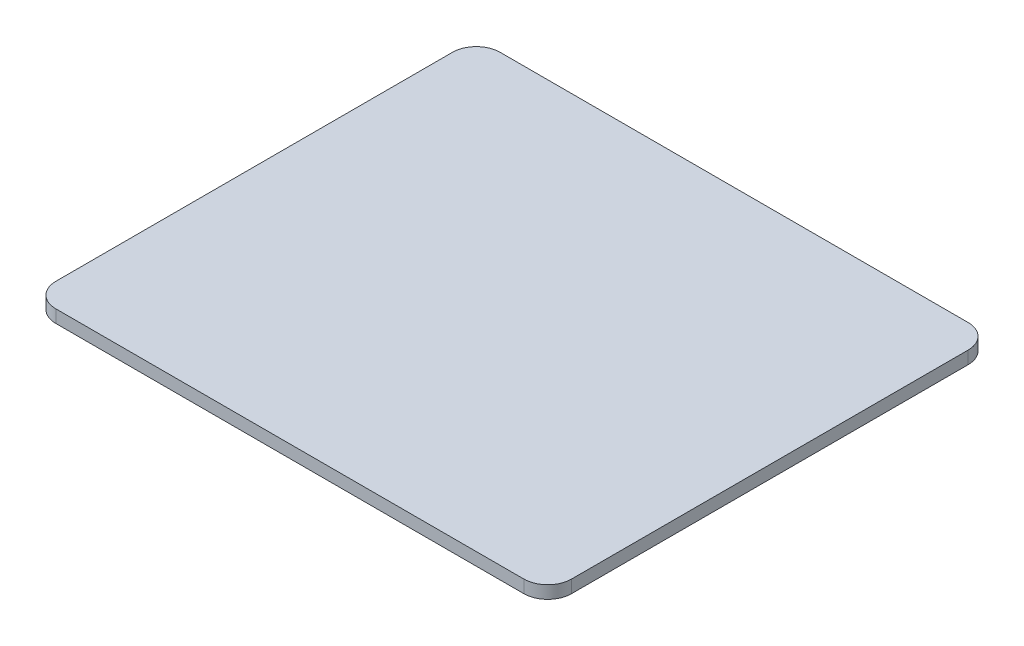
ISO-10303-21;
HEADER;
FILE_DESCRIPTION(('STEP AP214'),'2;1');
FILE_NAME('part.step','',(''),(''),'','','');
FILE_SCHEMA(('AUTOMOTIVE_DESIGN { 1 0 10303 214 1 1 1 1 }'));
ENDSEC;
DATA;
#1=APPLICATION_CONTEXT('core data for automotive mechanical design processes');
#2=APPLICATION_PROTOCOL_DEFINITION('international standard','automotive_design',2000,#1);
#3=PRODUCT_CONTEXT('',#1,'mechanical');
#4=PRODUCT('Part','Part','',(#3));
#5=PRODUCT_RELATED_PRODUCT_CATEGORY('part','',(#4));
#6=PRODUCT_DEFINITION_FORMATION('','',#4);
#7=PRODUCT_DEFINITION_CONTEXT('part definition',#1,'design');
#8=PRODUCT_DEFINITION('design','',#6,#7);
#9=PRODUCT_DEFINITION_SHAPE('','',#8);
#10=(LENGTH_UNIT() NAMED_UNIT(*) SI_UNIT(.MILLI.,.METRE.));
#11=(NAMED_UNIT(*) PLANE_ANGLE_UNIT() SI_UNIT($,.RADIAN.));
#12=(NAMED_UNIT(*) SI_UNIT($,.STERADIAN.) SOLID_ANGLE_UNIT());
#13=UNCERTAINTY_MEASURE_WITH_UNIT(LENGTH_MEASURE(1.E-05),#10,'distance_accuracy_value','');
#14=(GEOMETRIC_REPRESENTATION_CONTEXT(3) GLOBAL_UNCERTAINTY_ASSIGNED_CONTEXT((#13)) GLOBAL_UNIT_ASSIGNED_CONTEXT((#10,
#11,#12)) REPRESENTATION_CONTEXT('',''));
#15=CARTESIAN_POINT('',(0.,0.,0.));
#16=DIRECTION('',(0.,0.,1.));
#17=DIRECTION('',(1.,0.,0.));
#18=AXIS2_PLACEMENT_3D('',#15,#16,#17);
#19=CARTESIAN_POINT('',(-32.5,1.6,28.));
#20=DIRECTION('',(1.,0.,0.));
#21=DIRECTION('',(0.,0.,-1.));
#22=AXIS2_PLACEMENT_3D('',#19,#20,#21);
#23=PLANE('',#22);
#24=DIRECTION('',(0.,0.,1.));
#25=VECTOR('',#24,1.);
#26=CARTESIAN_POINT('',(-32.5,1.6,28.));
#27=LINE('',#26,#25);
#28=CARTESIAN_POINT('',(-32.5,1.6,-25.));
#29=VERTEX_POINT('',#28);
#30=CARTESIAN_POINT('',(-32.5,1.6,25.));
#31=VERTEX_POINT('',#30);
#32=EDGE_CURVE('E122',#29,#31,#27,.T.);
#33=ORIENTED_EDGE('',*,*,#32,.F.);
#34=DIRECTION('',(0.,-1.,0.));
#35=VECTOR('',#34,1.);
#36=CARTESIAN_POINT('',(-32.5,1.6,-25.));
#37=LINE('',#36,#35);
#38=CARTESIAN_POINT('',(-32.5,0.,-25.));
#39=VERTEX_POINT('',#38);
#40=EDGE_CURVE('E107',#29,#39,#37,.T.);
#41=ORIENTED_EDGE('',*,*,#40,.T.);
#42=DIRECTION('',(0.,0.,1.));
#43=VECTOR('',#42,1.);
#44=CARTESIAN_POINT('',(-32.5,0.,28.));
#45=LINE('',#44,#43);
#46=CARTESIAN_POINT('',(-32.5,0.,25.));
#47=VERTEX_POINT('',#46);
#48=EDGE_CURVE('E119',#39,#47,#45,.T.);
#49=ORIENTED_EDGE('',*,*,#48,.T.);
#50=DIRECTION('',(0.,-1.,0.));
#51=VECTOR('',#50,1.);
#52=CARTESIAN_POINT('',(-32.5,1.6,25.));
#53=LINE('',#52,#51);
#54=EDGE_CURVE('E124',#47,#31,#53,.F.);
#55=ORIENTED_EDGE('',*,*,#54,.T.);
#56=EDGE_LOOP('',(#33,#41,#49,#55));
#57=FACE_BOUND('',#56,.T.);
#58=ADVANCED_FACE('F37',(#57),#23,.F.);
#59=CARTESIAN_POINT('',(32.5,1.6,28.));
#60=DIRECTION('',(0.,0.,-1.));
#61=DIRECTION('',(-1.,0.,0.));
#62=AXIS2_PLACEMENT_3D('',#59,#60,#61);
#63=PLANE('',#62);
#64=DIRECTION('',(1.,0.,0.));
#65=VECTOR('',#64,1.);
#66=CARTESIAN_POINT('',(32.5,0.,28.));
#67=LINE('',#66,#65);
#68=CARTESIAN_POINT('',(-29.5,0.,28.));
#69=VERTEX_POINT('',#68);
#70=CARTESIAN_POINT('',(29.5,0.,28.));
#71=VERTEX_POINT('',#70);
#72=EDGE_CURVE('E128',#69,#71,#67,.T.);
#73=ORIENTED_EDGE('',*,*,#72,.T.);
#74=DIRECTION('',(0.,-1.,0.));
#75=VECTOR('',#74,1.);
#76=CARTESIAN_POINT('',(29.5,1.6,28.));
#77=LINE('',#76,#75);
#78=CARTESIAN_POINT('',(29.5,1.6,28.));
#79=VERTEX_POINT('',#78);
#80=EDGE_CURVE('E11',#71,#79,#77,.F.);
#81=ORIENTED_EDGE('',*,*,#80,.T.);
#82=DIRECTION('',(1.,0.,0.));
#83=VECTOR('',#82,1.);
#84=CARTESIAN_POINT('',(32.5,1.6,28.));
#85=LINE('',#84,#83);
#86=CARTESIAN_POINT('',(-29.5,1.6,28.));
#87=VERTEX_POINT('',#86);
#88=EDGE_CURVE('E164',#87,#79,#85,.T.);
#89=ORIENTED_EDGE('',*,*,#88,.F.);
#90=DIRECTION('',(0.,-1.,0.));
#91=VECTOR('',#90,1.);
#92=CARTESIAN_POINT('',(-29.5,1.6,28.));
#93=LINE('',#92,#91);
#94=EDGE_CURVE('E45',#87,#69,#93,.T.);
#95=ORIENTED_EDGE('',*,*,#94,.T.);
#96=EDGE_LOOP('',(#73,#81,#89,#95));
#97=FACE_BOUND('',#96,.T.);
#98=ADVANCED_FACE('F162',(#97),#63,.F.);
#99=CARTESIAN_POINT('',(32.5,1.6,28.));
#100=DIRECTION('',(-1.,0.,0.));
#101=DIRECTION('',(0.,0.,1.));
#102=AXIS2_PLACEMENT_3D('',#99,#100,#101);
#103=PLANE('',#102);
#104=DIRECTION('',(0.,0.,-1.));
#105=VECTOR('',#104,1.);
#106=CARTESIAN_POINT('',(32.5,0.,28.));
#107=LINE('',#106,#105);
#108=CARTESIAN_POINT('',(32.5,0.,25.));
#109=VERTEX_POINT('',#108);
#110=CARTESIAN_POINT('',(32.5,0.,-25.));
#111=VERTEX_POINT('',#110);
#112=EDGE_CURVE('E131',#109,#111,#107,.T.);
#113=ORIENTED_EDGE('',*,*,#112,.T.);
#114=DIRECTION('',(0.,-1.,0.));
#115=VECTOR('',#114,1.);
#116=CARTESIAN_POINT('',(32.5,1.6,-25.));
#117=LINE('',#116,#115);
#118=CARTESIAN_POINT('',(32.5,1.6,-25.));
#119=VERTEX_POINT('',#118);
#120=EDGE_CURVE('E52',#111,#119,#117,.F.);
#121=ORIENTED_EDGE('',*,*,#120,.T.);
#122=DIRECTION('',(0.,0.,-1.));
#123=VECTOR('',#122,1.);
#124=CARTESIAN_POINT('',(32.5,1.6,28.));
#125=LINE('',#124,#123);
#126=CARTESIAN_POINT('',(32.5,1.6,25.));
#127=VERTEX_POINT('',#126);
#128=EDGE_CURVE('E172',#127,#119,#125,.T.);
#129=ORIENTED_EDGE('',*,*,#128,.F.);
#130=DIRECTION('',(0.,-1.,0.));
#131=VECTOR('',#130,1.);
#132=CARTESIAN_POINT('',(32.5,1.6,25.));
#133=LINE('',#132,#131);
#134=EDGE_CURVE('E155',#127,#109,#133,.T.);
#135=ORIENTED_EDGE('',*,*,#134,.T.);
#136=EDGE_LOOP('',(#113,#121,#129,#135));
#137=FACE_BOUND('',#136,.T.);
#138=ADVANCED_FACE('F171',(#137),#103,.F.);
#139=CARTESIAN_POINT('',(32.5,1.6,-28.));
#140=DIRECTION('',(0.,0.,1.));
#141=DIRECTION('',(1.,0.,0.));
#142=AXIS2_PLACEMENT_3D('',#139,#140,#141);
#143=PLANE('',#142);
#144=DIRECTION('',(-1.,0.,0.));
#145=VECTOR('',#144,1.);
#146=CARTESIAN_POINT('',(32.5,0.,-28.));
#147=LINE('',#146,#145);
#148=CARTESIAN_POINT('',(29.5,0.,-28.));
#149=VERTEX_POINT('',#148);
#150=CARTESIAN_POINT('',(-29.5,0.,-28.));
#151=VERTEX_POINT('',#150);
#152=EDGE_CURVE('E138',#149,#151,#147,.T.);
#153=ORIENTED_EDGE('',*,*,#152,.T.);
#154=DIRECTION('',(0.,-1.,0.));
#155=VECTOR('',#154,1.);
#156=CARTESIAN_POINT('',(-29.5,1.6,-28.));
#157=LINE('',#156,#155);
#158=CARTESIAN_POINT('',(-29.5,1.6,-28.));
#159=VERTEX_POINT('',#158);
#160=EDGE_CURVE('E108',#151,#159,#157,.F.);
#161=ORIENTED_EDGE('',*,*,#160,.T.);
#162=DIRECTION('',(-1.,0.,0.));
#163=VECTOR('',#162,1.);
#164=CARTESIAN_POINT('',(32.5,1.6,-28.));
#165=LINE('',#164,#163);
#166=CARTESIAN_POINT('',(29.5,1.6,-28.));
#167=VERTEX_POINT('',#166);
#168=EDGE_CURVE('E134',#167,#159,#165,.T.);
#169=ORIENTED_EDGE('',*,*,#168,.F.);
#170=DIRECTION('',(0.,-1.,0.));
#171=VECTOR('',#170,1.);
#172=CARTESIAN_POINT('',(29.5,1.6,-28.));
#173=LINE('',#172,#171);
#174=EDGE_CURVE('E113',#167,#149,#173,.T.);
#175=ORIENTED_EDGE('',*,*,#174,.T.);
#176=EDGE_LOOP('',(#153,#161,#169,#175));
#177=FACE_BOUND('',#176,.T.);
#178=ADVANCED_FACE('F200',(#177),#143,.F.);
#179=CARTESIAN_POINT('',(0.,1.6,0.));
#180=DIRECTION('',(0.,1.,0.));
#181=DIRECTION('',(0.,0.,1.));
#182=AXIS2_PLACEMENT_3D('',#179,#180,#181);
#183=PLANE('',#182);
#184=ORIENTED_EDGE('',*,*,#168,.T.);
#185=CARTESIAN_POINT('',(-29.5,1.6,-25.));
#186=DIRECTION('',(0.,1.,0.));
#187=DIRECTION('',(0.,0.,1.));
#188=AXIS2_PLACEMENT_3D('',#185,#186,#187);
#189=CIRCLE('',#188,3.);
#190=EDGE_CURVE('E153',#159,#29,#189,.T.);
#191=ORIENTED_EDGE('',*,*,#190,.T.);
#192=ORIENTED_EDGE('',*,*,#32,.T.);
#193=CARTESIAN_POINT('',(-29.5,1.6,25.));
#194=DIRECTION('',(0.,1.,0.));
#195=DIRECTION('',(0.,0.,1.));
#196=AXIS2_PLACEMENT_3D('',#193,#194,#195);
#197=CIRCLE('',#196,3.);
#198=EDGE_CURVE('E148',#31,#87,#197,.T.);
#199=ORIENTED_EDGE('',*,*,#198,.T.);
#200=ORIENTED_EDGE('',*,*,#88,.T.);
#201=CARTESIAN_POINT('',(29.5,1.6,25.));
#202=DIRECTION('',(0.,1.,0.));
#203=DIRECTION('',(0.,0.,1.));
#204=AXIS2_PLACEMENT_3D('',#201,#202,#203);
#205=CIRCLE('',#204,3.);
#206=EDGE_CURVE('E59',#79,#127,#205,.T.);
#207=ORIENTED_EDGE('',*,*,#206,.T.);
#208=ORIENTED_EDGE('',*,*,#128,.T.);
#209=CARTESIAN_POINT('',(29.5,1.6,-25.));
#210=DIRECTION('',(0.,1.,0.));
#211=DIRECTION('',(0.,0.,1.));
#212=AXIS2_PLACEMENT_3D('',#209,#210,#211);
#213=CIRCLE('',#212,3.);
#214=EDGE_CURVE('E151',#119,#167,#213,.T.);
#215=ORIENTED_EDGE('',*,*,#214,.T.);
#216=EDGE_LOOP('',(#184,#191,#192,#199,#200,#207,#208,#215));
#217=FACE_BOUND('',#216,.T.);
#218=ADVANCED_FACE('F177',(#217),#183,.T.);
#219=CARTESIAN_POINT('',(0.,0.,0.));
#220=DIRECTION('',(0.,1.,0.));
#221=DIRECTION('',(0.,0.,1.));
#222=AXIS2_PLACEMENT_3D('',#219,#220,#221);
#223=PLANE('',#222);
#224=ORIENTED_EDGE('',*,*,#48,.F.);
#225=CARTESIAN_POINT('',(-29.5,0.,-25.));
#226=DIRECTION('',(0.,1.,0.));
#227=DIRECTION('',(0.,0.,1.));
#228=AXIS2_PLACEMENT_3D('',#225,#226,#227);
#229=CIRCLE('',#228,3.);
#230=EDGE_CURVE('E103',#39,#151,#229,.F.);
#231=ORIENTED_EDGE('',*,*,#230,.T.);
#232=ORIENTED_EDGE('',*,*,#152,.F.);
#233=CARTESIAN_POINT('',(29.5,0.,-25.));
#234=DIRECTION('',(0.,1.,0.));
#235=DIRECTION('',(0.,0.,1.));
#236=AXIS2_PLACEMENT_3D('',#233,#234,#235);
#237=CIRCLE('',#236,3.);
#238=EDGE_CURVE('E114',#149,#111,#237,.F.);
#239=ORIENTED_EDGE('',*,*,#238,.T.);
#240=ORIENTED_EDGE('',*,*,#112,.F.);
#241=CARTESIAN_POINT('',(29.5,0.,25.));
#242=DIRECTION('',(0.,1.,0.));
#243=DIRECTION('',(0.,0.,1.));
#244=AXIS2_PLACEMENT_3D('',#241,#242,#243);
#245=CIRCLE('',#244,3.);
#246=EDGE_CURVE('E142',#109,#71,#245,.F.);
#247=ORIENTED_EDGE('',*,*,#246,.T.);
#248=ORIENTED_EDGE('',*,*,#72,.F.);
#249=CARTESIAN_POINT('',(-29.5,0.,25.));
#250=DIRECTION('',(0.,1.,0.));
#251=DIRECTION('',(0.,0.,1.));
#252=AXIS2_PLACEMENT_3D('',#249,#250,#251);
#253=CIRCLE('',#252,3.);
#254=EDGE_CURVE('E123',#69,#47,#253,.F.);
#255=ORIENTED_EDGE('',*,*,#254,.T.);
#256=EDGE_LOOP('',(#224,#231,#232,#239,#240,#247,#248,#255));
#257=FACE_BOUND('',#256,.T.);
#258=ADVANCED_FACE('F126',(#257),#223,.F.);
#259=CARTESIAN_POINT('',(-29.5,1.6,-25.));
#260=DIRECTION('',(0.,-1.,0.));
#261=DIRECTION('',(0.,0.,-1.));
#262=AXIS2_PLACEMENT_3D('',#259,#260,#261);
#263=CYLINDRICAL_SURFACE('',#262,3.);
#264=ORIENTED_EDGE('',*,*,#190,.F.);
#265=ORIENTED_EDGE('',*,*,#160,.F.);
#266=ORIENTED_EDGE('',*,*,#230,.F.);
#267=ORIENTED_EDGE('',*,*,#40,.F.);
#268=EDGE_LOOP('',(#264,#265,#266,#267));
#269=FACE_BOUND('',#268,.T.);
#270=ADVANCED_FACE('F106',(#269),#263,.T.);
#271=CARTESIAN_POINT('',(29.5,1.6,-25.));
#272=DIRECTION('',(0.,-1.,0.));
#273=DIRECTION('',(0.,0.,-1.));
#274=AXIS2_PLACEMENT_3D('',#271,#272,#273);
#275=CYLINDRICAL_SURFACE('',#274,3.);
#276=ORIENTED_EDGE('',*,*,#214,.F.);
#277=ORIENTED_EDGE('',*,*,#120,.F.);
#278=ORIENTED_EDGE('',*,*,#238,.F.);
#279=ORIENTED_EDGE('',*,*,#174,.F.);
#280=EDGE_LOOP('',(#276,#277,#278,#279));
#281=FACE_BOUND('',#280,.T.);
#282=ADVANCED_FACE('F182',(#281),#275,.T.);
#283=CARTESIAN_POINT('',(29.5,1.6,25.));
#284=DIRECTION('',(0.,-1.,0.));
#285=DIRECTION('',(0.,0.,-1.));
#286=AXIS2_PLACEMENT_3D('',#283,#284,#285);
#287=CYLINDRICAL_SURFACE('',#286,3.);
#288=ORIENTED_EDGE('',*,*,#206,.F.);
#289=ORIENTED_EDGE('',*,*,#80,.F.);
#290=ORIENTED_EDGE('',*,*,#246,.F.);
#291=ORIENTED_EDGE('',*,*,#134,.F.);
#292=EDGE_LOOP('',(#288,#289,#290,#291));
#293=FACE_BOUND('',#292,.T.);
#294=ADVANCED_FACE('F170',(#293),#287,.T.);
#295=CARTESIAN_POINT('',(-29.5,1.6,25.));
#296=DIRECTION('',(0.,-1.,0.));
#297=DIRECTION('',(0.,0.,-1.));
#298=AXIS2_PLACEMENT_3D('',#295,#296,#297);
#299=CYLINDRICAL_SURFACE('',#298,3.);
#300=ORIENTED_EDGE('',*,*,#198,.F.);
#301=ORIENTED_EDGE('',*,*,#54,.F.);
#302=ORIENTED_EDGE('',*,*,#254,.F.);
#303=ORIENTED_EDGE('',*,*,#94,.F.);
#304=EDGE_LOOP('',(#300,#301,#302,#303));
#305=FACE_BOUND('',#304,.T.);
#306=ADVANCED_FACE('F39',(#305),#299,.T.);
#307=CLOSED_SHELL('',(#58,#98,#138,#178,#218,#258,#270,#282,#294,#306));
#308=MANIFOLD_SOLID_BREP('B2',#307);
#309=ADVANCED_BREP_SHAPE_REPRESENTATION('',(#18,#308),#14);
#310=SHAPE_DEFINITION_REPRESENTATION(#9,#309);
ENDSEC;
END-ISO-10303-21;
